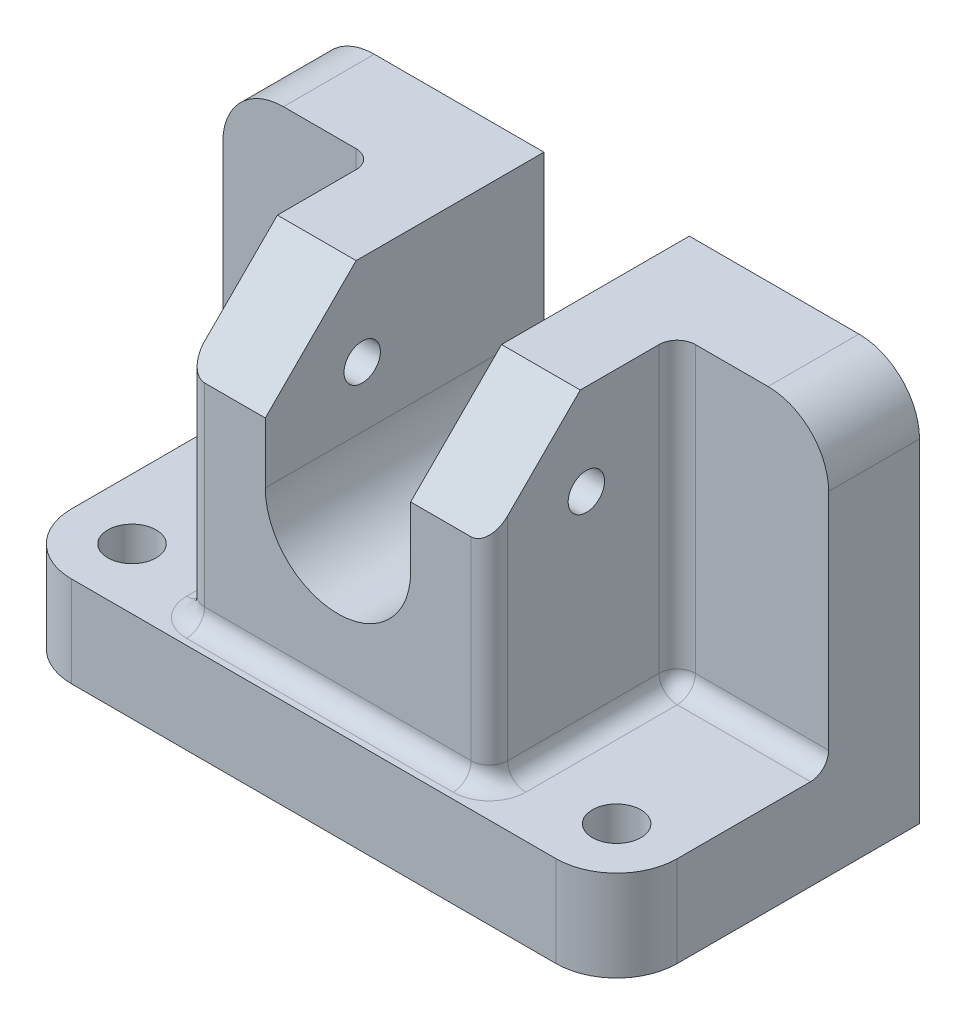
ISO-10303-21;
HEADER;
FILE_DESCRIPTION(('STEP AP214'),'2;1');
FILE_NAME('part.step','',(''),(''),'','','');
FILE_SCHEMA(('AUTOMOTIVE_DESIGN { 1 0 10303 214 1 1 1 1 }'));
ENDSEC;
DATA;
#1=APPLICATION_CONTEXT('core data for automotive mechanical design processes');
#2=APPLICATION_PROTOCOL_DEFINITION('international standard','automotive_design',2000,#1);
#3=PRODUCT_CONTEXT('',#1,'mechanical');
#4=PRODUCT('Part','Part','',(#3));
#5=PRODUCT_RELATED_PRODUCT_CATEGORY('part','',(#4));
#6=PRODUCT_DEFINITION_FORMATION('','',#4);
#7=PRODUCT_DEFINITION_CONTEXT('part definition',#1,'design');
#8=PRODUCT_DEFINITION('design','',#6,#7);
#9=PRODUCT_DEFINITION_SHAPE('','',#8);
#10=(LENGTH_UNIT() NAMED_UNIT(*) SI_UNIT(.MILLI.,.METRE.));
#11=(NAMED_UNIT(*) PLANE_ANGLE_UNIT() SI_UNIT($,.RADIAN.));
#12=(NAMED_UNIT(*) SI_UNIT($,.STERADIAN.) SOLID_ANGLE_UNIT());
#13=UNCERTAINTY_MEASURE_WITH_UNIT(LENGTH_MEASURE(1.E-05),#10,'distance_accuracy_value','');
#14=(GEOMETRIC_REPRESENTATION_CONTEXT(3) GLOBAL_UNCERTAINTY_ASSIGNED_CONTEXT((#13)) GLOBAL_UNIT_ASSIGNED_CONTEXT((#10,
#11,#12)) REPRESENTATION_CONTEXT('',''));
#15=CARTESIAN_POINT('',(0.,0.,0.));
#16=DIRECTION('',(0.,0.,1.));
#17=DIRECTION('',(1.,0.,0.));
#18=AXIS2_PLACEMENT_3D('',#15,#16,#17);
#19=CARTESIAN_POINT('',(-50.,15.,50.));
#20=DIRECTION('',(0.,-1.,0.));
#21=DIRECTION('',(0.,0.,-1.));
#22=AXIS2_PLACEMENT_3D('',#19,#20,#21);
#23=PLANE('',#22);
#24=CARTESIAN_POINT('',(40.,15.,40.));
#25=DIRECTION('',(0.,1.,0.));
#26=DIRECTION('',(0.,0.,1.));
#27=AXIS2_PLACEMENT_3D('',#24,#25,#26);
#28=CIRCLE('',#27,4.);
#29=CARTESIAN_POINT('',(40.,15.,44.));
#30=VERTEX_POINT('',#29);
#31=EDGE_CURVE('E551',#30,#30,#28,.T.);
#32=ORIENTED_EDGE('',*,*,#31,.F.);
#33=EDGE_LOOP('',(#32));
#34=FACE_BOUND('',#33,.T.);
#35=DIRECTION('',(0.,0.,-1.));
#36=VECTOR('',#35,1.);
#37=CARTESIAN_POINT('',(50.,15.,50.));
#38=LINE('',#37,#36);
#39=CARTESIAN_POINT('',(50.,15.,40.));
#40=VERTEX_POINT('',#39);
#41=CARTESIAN_POINT('',(50.,15.,18.));
#42=VERTEX_POINT('',#41);
#43=EDGE_CURVE('E440',#40,#42,#38,.T.);
#44=ORIENTED_EDGE('',*,*,#43,.T.);
#45=DIRECTION('',(1.,0.,0.));
#46=VECTOR('',#45,1.);
#47=CARTESIAN_POINT('',(28.,15.,18.));
#48=LINE('',#47,#46);
#49=CARTESIAN_POINT('',(28.,15.,18.));
#50=VERTEX_POINT('',#49);
#51=EDGE_CURVE('E373',#42,#50,#48,.F.);
#52=ORIENTED_EDGE('',*,*,#51,.T.);
#53=DIRECTION('',(0.,0.,-1.));
#54=VECTOR('',#53,1.);
#55=CARTESIAN_POINT('',(28.,15.,43.));
#56=LINE('',#55,#54);
#57=CARTESIAN_POINT('',(28.,15.,43.));
#58=VERTEX_POINT('',#57);
#59=EDGE_CURVE('E371',#50,#58,#56,.F.);
#60=ORIENTED_EDGE('',*,*,#59,.T.);
#61=CARTESIAN_POINT('',(22.,15.,43.));
#62=DIRECTION('',(0.,-1.,0.));
#63=DIRECTION('',(0.,0.,-1.));
#64=AXIS2_PLACEMENT_3D('',#61,#62,#63);
#65=CIRCLE('',#64,6.);
#66=CARTESIAN_POINT('',(22.,15.,49.));
#67=VERTEX_POINT('',#66);
#68=EDGE_CURVE('E369',#58,#67,#65,.T.);
#69=ORIENTED_EDGE('',*,*,#68,.T.);
#70=DIRECTION('',(1.,0.,0.));
#71=VECTOR('',#70,1.);
#72=CARTESIAN_POINT('',(-22.,15.,49.));
#73=LINE('',#72,#71);
#74=CARTESIAN_POINT('',(-22.,15.,49.));
#75=VERTEX_POINT('',#74);
#76=EDGE_CURVE('E367',#67,#75,#73,.F.);
#77=ORIENTED_EDGE('',*,*,#76,.T.);
#78=CARTESIAN_POINT('',(-22.,15.,43.));
#79=DIRECTION('',(0.,-1.,0.));
#80=DIRECTION('',(0.,0.,-1.));
#81=AXIS2_PLACEMENT_3D('',#78,#79,#80);
#82=CIRCLE('',#81,6.);
#83=CARTESIAN_POINT('',(-28.,15.,43.));
#84=VERTEX_POINT('',#83);
#85=EDGE_CURVE('E365',#75,#84,#82,.T.);
#86=ORIENTED_EDGE('',*,*,#85,.T.);
#87=DIRECTION('',(0.,0.,1.));
#88=VECTOR('',#87,1.);
#89=CARTESIAN_POINT('',(-28.,15.,18.));
#90=LINE('',#89,#88);
#91=CARTESIAN_POINT('',(-28.,15.,18.));
#92=VERTEX_POINT('',#91);
#93=EDGE_CURVE('E363',#84,#92,#90,.F.);
#94=ORIENTED_EDGE('',*,*,#93,.T.);
#95=DIRECTION('',(1.,0.,0.));
#96=VECTOR('',#95,1.);
#97=CARTESIAN_POINT('',(-50.,15.,18.));
#98=LINE('',#97,#96);
#99=CARTESIAN_POINT('',(-50.,15.,18.));
#100=VERTEX_POINT('',#99);
#101=EDGE_CURVE('E361',#92,#100,#98,.F.);
#102=ORIENTED_EDGE('',*,*,#101,.T.);
#103=DIRECTION('',(0.,0.,-1.));
#104=VECTOR('',#103,1.);
#105=CARTESIAN_POINT('',(-50.,15.,50.));
#106=LINE('',#105,#104);
#107=CARTESIAN_POINT('',(-50.,15.,40.));
#108=VERTEX_POINT('',#107);
#109=EDGE_CURVE('E441',#108,#100,#106,.T.);
#110=ORIENTED_EDGE('',*,*,#109,.F.);
#111=CARTESIAN_POINT('',(-40.,15.,40.));
#112=DIRECTION('',(0.,-1.,0.));
#113=DIRECTION('',(0.,0.,-1.));
#114=AXIS2_PLACEMENT_3D('',#111,#112,#113);
#115=CIRCLE('',#114,10.);
#116=CARTESIAN_POINT('',(-40.,15.,50.));
#117=VERTEX_POINT('',#116);
#118=EDGE_CURVE('E309',#108,#117,#115,.F.);
#119=ORIENTED_EDGE('',*,*,#118,.T.);
#120=DIRECTION('',(1.,0.,0.));
#121=VECTOR('',#120,1.);
#122=CARTESIAN_POINT('',(-50.,15.,50.));
#123=LINE('',#122,#121);
#124=CARTESIAN_POINT('',(40.,15.,50.));
#125=VERTEX_POINT('',#124);
#126=EDGE_CURVE('E446',#117,#125,#123,.T.);
#127=ORIENTED_EDGE('',*,*,#126,.T.);
#128=CARTESIAN_POINT('',(40.,15.,40.));
#129=DIRECTION('',(0.,-1.,0.));
#130=DIRECTION('',(0.,0.,-1.));
#131=AXIS2_PLACEMENT_3D('',#128,#129,#130);
#132=CIRCLE('',#131,10.);
#133=EDGE_CURVE('E307',#125,#40,#132,.F.);
#134=ORIENTED_EDGE('',*,*,#133,.T.);
#135=EDGE_LOOP('',(#44,#52,#60,#69,#77,#86,#94,#102,#110,#119,#127,#134));
#136=FACE_BOUND('',#135,.T.);
#137=CARTESIAN_POINT('',(-40.,15.,40.));
#138=DIRECTION('',(0.,1.,0.));
#139=DIRECTION('',(0.,0.,1.));
#140=AXIS2_PLACEMENT_3D('',#137,#138,#139);
#141=CIRCLE('',#140,4.);
#142=CARTESIAN_POINT('',(-40.,15.,44.));
#143=VERTEX_POINT('',#142);
#144=EDGE_CURVE('E545',#143,#143,#141,.T.);
#145=ORIENTED_EDGE('',*,*,#144,.F.);
#146=EDGE_LOOP('',(#145));
#147=FACE_BOUND('',#146,.T.);
#148=ADVANCED_FACE('F46',(#34,#136,#147),#23,.F.);
#149=CARTESIAN_POINT('',(-50.,65.,50.));
#150=DIRECTION('',(0.,-1.,0.));
#151=DIRECTION('',(0.,0.,-1.));
#152=AXIS2_PLACEMENT_3D('',#149,#150,#151);
#153=PLANE('',#152);
#154=DIRECTION('',(0.,0.,1.));
#155=VECTOR('',#154,1.);
#156=CARTESIAN_POINT('',(25.,65.,15.));
#157=LINE('',#156,#155);
#158=CARTESIAN_POINT('',(25.,65.,18.));
#159=VERTEX_POINT('',#158);
#160=CARTESIAN_POINT('',(25.,65.,30.9999999999999));
#161=VERTEX_POINT('',#160);
#162=EDGE_CURVE('E432',#159,#161,#157,.T.);
#163=ORIENTED_EDGE('',*,*,#162,.F.);
#164=CARTESIAN_POINT('',(28.,65.,18.));
#165=DIRECTION('',(0.,-1.,0.));
#166=DIRECTION('',(0.,0.,-1.));
#167=AXIS2_PLACEMENT_3D('',#164,#165,#166);
#168=CIRCLE('',#167,3.);
#169=CARTESIAN_POINT('',(28.,65.,15.));
#170=VERTEX_POINT('',#169);
#171=EDGE_CURVE('E340',#159,#170,#168,.T.);
#172=ORIENTED_EDGE('',*,*,#171,.T.);
#173=DIRECTION('',(1.,0.,0.));
#174=VECTOR('',#173,1.);
#175=CARTESIAN_POINT('',(-50.,65.,15.));
#176=LINE('',#175,#174);
#177=CARTESIAN_POINT('',(40.,65.,15.));
#178=VERTEX_POINT('',#177);
#179=EDGE_CURVE('E454',#170,#178,#176,.T.);
#180=ORIENTED_EDGE('',*,*,#179,.T.);
#181=DIRECTION('',(0.,0.,-1.));
#182=VECTOR('',#181,1.);
#183=CARTESIAN_POINT('',(40.,65.,50.));
#184=LINE('',#183,#182);
#185=CARTESIAN_POINT('',(40.,65.,0.));
#186=VERTEX_POINT('',#185);
#187=EDGE_CURVE('E316',#178,#186,#184,.T.);
#188=ORIENTED_EDGE('',*,*,#187,.T.);
#189=DIRECTION('',(-1.,0.,0.));
#190=VECTOR('',#189,1.);
#191=CARTESIAN_POINT('',(-50.,65.,0.));
#192=LINE('',#191,#190);
#193=CARTESIAN_POINT('',(12.,65.,0.));
#194=VERTEX_POINT('',#193);
#195=EDGE_CURVE('E260',#186,#194,#192,.T.);
#196=ORIENTED_EDGE('',*,*,#195,.T.);
#197=DIRECTION('',(0.,0.,1.));
#198=VECTOR('',#197,1.);
#199=CARTESIAN_POINT('',(12.,65.,0.));
#200=LINE('',#199,#198);
#201=CARTESIAN_POINT('',(12.,65.,30.9999999999999));
#202=VERTEX_POINT('',#201);
#203=EDGE_CURVE('E429',#194,#202,#200,.T.);
#204=ORIENTED_EDGE('',*,*,#203,.T.);
#205=DIRECTION('',(1.,0.,0.));
#206=VECTOR('',#205,1.);
#207=CARTESIAN_POINT('',(-50.,65.,31.));
#208=LINE('',#207,#206);
#209=EDGE_CURVE('E286',#202,#161,#208,.T.);
#210=ORIENTED_EDGE('',*,*,#209,.T.);
#211=EDGE_LOOP('',(#163,#172,#180,#188,#196,#204,#210));
#212=FACE_BOUND('',#211,.T.);
#213=ADVANCED_FACE('F589',(#212),#153,.F.);
#214=CARTESIAN_POINT('',(-50.,65.,15.));
#215=DIRECTION('',(0.,0.,-1.));
#216=DIRECTION('',(0.,1.,0.));
#217=AXIS2_PLACEMENT_3D('',#214,#215,#216);
#218=PLANE('',#217);
#219=DIRECTION('',(0.,-1.,0.));
#220=VECTOR('',#219,1.);
#221=CARTESIAN_POINT('',(28.,15.,15.));
#222=LINE('',#221,#220);
#223=CARTESIAN_POINT('',(28.,18.,15.));
#224=VERTEX_POINT('',#223);
#225=EDGE_CURVE('E330',#170,#224,#222,.T.);
#226=ORIENTED_EDGE('',*,*,#225,.T.);
#227=DIRECTION('',(1.,0.,0.));
#228=VECTOR('',#227,1.);
#229=CARTESIAN_POINT('',(50.,18.,15.));
#230=LINE('',#229,#228);
#231=CARTESIAN_POINT('',(50.,18.,15.));
#232=VERTEX_POINT('',#231);
#233=EDGE_CURVE('E358',#224,#232,#230,.T.);
#234=ORIENTED_EDGE('',*,*,#233,.T.);
#235=DIRECTION('',(0.,1.,0.));
#236=VECTOR('',#235,1.);
#237=CARTESIAN_POINT('',(50.,65.,15.));
#238=LINE('',#237,#236);
#239=CARTESIAN_POINT('',(50.,55.,15.));
#240=VERTEX_POINT('',#239);
#241=EDGE_CURVE('E444',#232,#240,#238,.T.);
#242=ORIENTED_EDGE('',*,*,#241,.T.);
#243=CARTESIAN_POINT('',(40.,55.,15.));
#244=DIRECTION('',(0.,0.,-1.));
#245=DIRECTION('',(0.,1.,0.));
#246=AXIS2_PLACEMENT_3D('',#243,#244,#245);
#247=CIRCLE('',#246,10.);
#248=EDGE_CURVE('E322',#240,#178,#247,.F.);
#249=ORIENTED_EDGE('',*,*,#248,.T.);
#250=ORIENTED_EDGE('',*,*,#179,.F.);
#251=EDGE_LOOP('',(#226,#234,#242,#249,#250));
#252=FACE_BOUND('',#251,.T.);
#253=ADVANCED_FACE('F479',(#252),#218,.F.);
#254=DIRECTION('',(0.,1.,0.));
#255=VECTOR('',#254,1.);
#256=CARTESIAN_POINT('',(-50.,65.,15.));
#257=LINE('',#256,#255);
#258=CARTESIAN_POINT('',(-50.,18.,15.));
#259=VERTEX_POINT('',#258);
#260=CARTESIAN_POINT('',(-50.,55.,15.));
#261=VERTEX_POINT('',#260);
#262=EDGE_CURVE('E443',#259,#261,#257,.T.);
#263=ORIENTED_EDGE('',*,*,#262,.F.);
#264=DIRECTION('',(1.,0.,0.));
#265=VECTOR('',#264,1.);
#266=CARTESIAN_POINT('',(-28.,18.,15.));
#267=LINE('',#266,#265);
#268=CARTESIAN_POINT('',(-28.,18.,15.));
#269=VERTEX_POINT('',#268);
#270=EDGE_CURVE('E68',#259,#269,#267,.T.);
#271=ORIENTED_EDGE('',*,*,#270,.T.);
#272=DIRECTION('',(0.,-1.,0.));
#273=VECTOR('',#272,1.);
#274=CARTESIAN_POINT('',(-28.,65.,15.));
#275=LINE('',#274,#273);
#276=CARTESIAN_POINT('',(-28.,65.,15.));
#277=VERTEX_POINT('',#276);
#278=EDGE_CURVE('E338',#269,#277,#275,.F.);
#279=ORIENTED_EDGE('',*,*,#278,.T.);
#280=CARTESIAN_POINT('',(-40.,65.,15.));
#281=VERTEX_POINT('',#280);
#282=EDGE_CURVE('E450',#281,#277,#176,.T.);
#283=ORIENTED_EDGE('',*,*,#282,.F.);
#284=CARTESIAN_POINT('',(-40.,55.,15.));
#285=DIRECTION('',(0.,0.,-1.));
#286=DIRECTION('',(0.,1.,0.));
#287=AXIS2_PLACEMENT_3D('',#284,#285,#286);
#288=CIRCLE('',#287,10.);
#289=EDGE_CURVE('E327',#281,#261,#288,.F.);
#290=ORIENTED_EDGE('',*,*,#289,.T.);
#291=EDGE_LOOP('',(#263,#271,#279,#283,#290));
#292=FACE_BOUND('',#291,.T.);
#293=ADVANCED_FACE('F614',(#292),#218,.F.);
#294=CARTESIAN_POINT('',(-50.,0.,50.));
#295=DIRECTION('',(1.,0.,0.));
#296=DIRECTION('',(0.,0.,-1.));
#297=AXIS2_PLACEMENT_3D('',#294,#295,#296);
#298=PLANE('',#297);
#299=DIRECTION('',(0.,0.,-1.));
#300=VECTOR('',#299,1.);
#301=CARTESIAN_POINT('',(-50.,0.,50.));
#302=LINE('',#301,#300);
#303=CARTESIAN_POINT('',(-50.,0.,40.));
#304=VERTEX_POINT('',#303);
#305=CARTESIAN_POINT('',(-50.,0.,0.));
#306=VERTEX_POINT('',#305);
#307=EDGE_CURVE('E271',#304,#306,#302,.T.);
#308=ORIENTED_EDGE('',*,*,#307,.F.);
#309=DIRECTION('',(0.,-1.,0.));
#310=VECTOR('',#309,1.);
#311=CARTESIAN_POINT('',(-50.,0.,40.));
#312=LINE('',#311,#310);
#313=EDGE_CURVE('E305',#304,#108,#312,.F.);
#314=ORIENTED_EDGE('',*,*,#313,.T.);
#315=ORIENTED_EDGE('',*,*,#109,.T.);
#316=CARTESIAN_POINT('',(-50.,18.,18.));
#317=DIRECTION('',(1.,0.,0.));
#318=DIRECTION('',(0.,0.,-1.));
#319=AXIS2_PLACEMENT_3D('',#316,#317,#318);
#320=CIRCLE('',#319,3.);
#321=EDGE_CURVE('E13',#100,#259,#320,.T.);
#322=ORIENTED_EDGE('',*,*,#321,.T.);
#323=ORIENTED_EDGE('',*,*,#262,.T.);
#324=DIRECTION('',(0.,0.,-1.));
#325=VECTOR('',#324,1.);
#326=CARTESIAN_POINT('',(-50.,55.,50.));
#327=LINE('',#326,#325);
#328=CARTESIAN_POINT('',(-50.,55.,0.));
#329=VERTEX_POINT('',#328);
#330=EDGE_CURVE('E302',#261,#329,#327,.T.);
#331=ORIENTED_EDGE('',*,*,#330,.T.);
#332=DIRECTION('',(0.,-1.,0.));
#333=VECTOR('',#332,1.);
#334=CARTESIAN_POINT('',(-50.,0.,0.));
#335=LINE('',#334,#333);
#336=EDGE_CURVE('E453',#329,#306,#335,.T.);
#337=ORIENTED_EDGE('',*,*,#336,.T.);
#338=EDGE_LOOP('',(#308,#314,#315,#322,#323,#331,#337));
#339=FACE_BOUND('',#338,.T.);
#340=ADVANCED_FACE('F610',(#339),#298,.F.);
#341=CARTESIAN_POINT('',(-50.,0.,50.));
#342=DIRECTION('',(0.,1.,0.));
#343=DIRECTION('',(0.,0.,1.));
#344=AXIS2_PLACEMENT_3D('',#341,#342,#343);
#345=PLANE('',#344);
#346=CARTESIAN_POINT('',(40.,0.,40.));
#347=DIRECTION('',(0.,1.,0.));
#348=DIRECTION('',(0.,0.,1.));
#349=AXIS2_PLACEMENT_3D('',#346,#347,#348);
#350=CIRCLE('',#349,4.);
#351=CARTESIAN_POINT('',(40.,0.,44.));
#352=VERTEX_POINT('',#351);
#353=EDGE_CURVE('E548',#352,#352,#350,.T.);
#354=ORIENTED_EDGE('',*,*,#353,.T.);
#355=EDGE_LOOP('',(#354));
#356=FACE_BOUND('',#355,.T.);
#357=CARTESIAN_POINT('',(-40.,0.,40.));
#358=DIRECTION('',(0.,1.,0.));
#359=DIRECTION('',(0.,0.,1.));
#360=AXIS2_PLACEMENT_3D('',#357,#358,#359);
#361=CIRCLE('',#360,4.);
#362=CARTESIAN_POINT('',(-40.,0.,44.));
#363=VERTEX_POINT('',#362);
#364=EDGE_CURVE('E395',#363,#363,#361,.T.);
#365=ORIENTED_EDGE('',*,*,#364,.T.);
#366=EDGE_LOOP('',(#365));
#367=FACE_BOUND('',#366,.T.);
#368=DIRECTION('',(1.,0.,0.));
#369=VECTOR('',#368,1.);
#370=CARTESIAN_POINT('',(-50.,0.,50.));
#371=LINE('',#370,#369);
#372=CARTESIAN_POINT('',(-40.,0.,50.));
#373=VERTEX_POINT('',#372);
#374=CARTESIAN_POINT('',(40.,0.,50.));
#375=VERTEX_POINT('',#374);
#376=EDGE_CURVE('E263',#373,#375,#371,.T.);
#377=ORIENTED_EDGE('',*,*,#376,.F.);
#378=CARTESIAN_POINT('',(-40.,0.,40.));
#379=DIRECTION('',(0.,1.,0.));
#380=DIRECTION('',(0.,0.,1.));
#381=AXIS2_PLACEMENT_3D('',#378,#379,#380);
#382=CIRCLE('',#381,10.);
#383=EDGE_CURVE('E300',#373,#304,#382,.F.);
#384=ORIENTED_EDGE('',*,*,#383,.T.);
#385=ORIENTED_EDGE('',*,*,#307,.T.);
#386=DIRECTION('',(1.,0.,0.));
#387=VECTOR('',#386,1.);
#388=CARTESIAN_POINT('',(-50.,0.,0.));
#389=LINE('',#388,#387);
#390=CARTESIAN_POINT('',(50.,0.,0.));
#391=VERTEX_POINT('',#390);
#392=EDGE_CURVE('E265',#306,#391,#389,.T.);
#393=ORIENTED_EDGE('',*,*,#392,.T.);
#394=DIRECTION('',(0.,0.,-1.));
#395=VECTOR('',#394,1.);
#396=CARTESIAN_POINT('',(50.,0.,50.));
#397=LINE('',#396,#395);
#398=CARTESIAN_POINT('',(50.,0.,40.));
#399=VERTEX_POINT('',#398);
#400=EDGE_CURVE('E269',#399,#391,#397,.T.);
#401=ORIENTED_EDGE('',*,*,#400,.F.);
#402=CARTESIAN_POINT('',(40.,0.,40.));
#403=DIRECTION('',(0.,1.,0.));
#404=DIRECTION('',(0.,0.,1.));
#405=AXIS2_PLACEMENT_3D('',#402,#403,#404);
#406=CIRCLE('',#405,10.);
#407=EDGE_CURVE('E298',#399,#375,#406,.F.);
#408=ORIENTED_EDGE('',*,*,#407,.T.);
#409=EDGE_LOOP('',(#377,#384,#385,#393,#401,#408));
#410=FACE_BOUND('',#409,.T.);
#411=ADVANCED_FACE('F465',(#356,#367,#410),#345,.F.);
#412=CARTESIAN_POINT('',(50.,0.,50.));
#413=DIRECTION('',(-1.,0.,0.));
#414=DIRECTION('',(0.,0.,1.));
#415=AXIS2_PLACEMENT_3D('',#412,#413,#414);
#416=PLANE('',#415);
#417=ORIENTED_EDGE('',*,*,#43,.F.);
#418=DIRECTION('',(0.,1.,0.));
#419=VECTOR('',#418,1.);
#420=CARTESIAN_POINT('',(50.,0.,40.));
#421=LINE('',#420,#419);
#422=EDGE_CURVE('E314',#40,#399,#421,.F.);
#423=ORIENTED_EDGE('',*,*,#422,.T.);
#424=ORIENTED_EDGE('',*,*,#400,.T.);
#425=DIRECTION('',(0.,1.,0.));
#426=VECTOR('',#425,1.);
#427=CARTESIAN_POINT('',(50.,0.,0.));
#428=LINE('',#427,#426);
#429=CARTESIAN_POINT('',(50.,55.,0.));
#430=VERTEX_POINT('',#429);
#431=EDGE_CURVE('E261',#391,#430,#428,.T.);
#432=ORIENTED_EDGE('',*,*,#431,.T.);
#433=DIRECTION('',(0.,0.,-1.));
#434=VECTOR('',#433,1.);
#435=CARTESIAN_POINT('',(50.,55.,50.));
#436=LINE('',#435,#434);
#437=EDGE_CURVE('E311',#430,#240,#436,.F.);
#438=ORIENTED_EDGE('',*,*,#437,.T.);
#439=ORIENTED_EDGE('',*,*,#241,.F.);
#440=CARTESIAN_POINT('',(50.,18.,18.));
#441=DIRECTION('',(-1.,0.,0.));
#442=DIRECTION('',(0.,0.,1.));
#443=AXIS2_PLACEMENT_3D('',#440,#441,#442);
#444=CIRCLE('',#443,3.);
#445=EDGE_CURVE('E55',#232,#42,#444,.T.);
#446=ORIENTED_EDGE('',*,*,#445,.T.);
#447=EDGE_LOOP('',(#417,#423,#424,#432,#438,#439,#446));
#448=FACE_BOUND('',#447,.T.);
#449=ADVANCED_FACE('F471',(#448),#416,.F.);
#450=CARTESIAN_POINT('',(-12.,65.,0.));
#451=VERTEX_POINT('',#450);
#452=CARTESIAN_POINT('',(-40.,65.,0.));
#453=VERTEX_POINT('',#452);
#454=EDGE_CURVE('E249',#451,#453,#192,.T.);
#455=ORIENTED_EDGE('',*,*,#454,.T.);
#456=DIRECTION('',(0.,0.,-1.));
#457=VECTOR('',#456,1.);
#458=CARTESIAN_POINT('',(-40.,65.,50.));
#459=LINE('',#458,#457);
#460=EDGE_CURVE('E325',#453,#281,#459,.F.);
#461=ORIENTED_EDGE('',*,*,#460,.T.);
#462=ORIENTED_EDGE('',*,*,#282,.T.);
#463=CARTESIAN_POINT('',(-28.,65.,18.));
#464=DIRECTION('',(0.,-1.,0.));
#465=DIRECTION('',(0.,0.,-1.));
#466=AXIS2_PLACEMENT_3D('',#463,#464,#465);
#467=CIRCLE('',#466,3.);
#468=CARTESIAN_POINT('',(-25.,65.,18.));
#469=VERTEX_POINT('',#468);
#470=EDGE_CURVE('E342',#277,#469,#467,.T.);
#471=ORIENTED_EDGE('',*,*,#470,.T.);
#472=DIRECTION('',(0.,0.,-1.));
#473=VECTOR('',#472,1.);
#474=CARTESIAN_POINT('',(-25.,65.,15.));
#475=LINE('',#474,#473);
#476=CARTESIAN_POINT('',(-25.,65.,31.));
#477=VERTEX_POINT('',#476);
#478=EDGE_CURVE('E437',#477,#469,#475,.T.);
#479=ORIENTED_EDGE('',*,*,#478,.F.);
#480=DIRECTION('',(1.,0.,0.));
#481=VECTOR('',#480,1.);
#482=CARTESIAN_POINT('',(-50.,65.,31.));
#483=LINE('',#482,#481);
#484=CARTESIAN_POINT('',(-12.,65.,30.9999999999999));
#485=VERTEX_POINT('',#484);
#486=EDGE_CURVE('E253',#477,#485,#483,.T.);
#487=ORIENTED_EDGE('',*,*,#486,.T.);
#488=DIRECTION('',(0.,0.,1.));
#489=VECTOR('',#488,1.);
#490=CARTESIAN_POINT('',(-12.,65.,0.));
#491=LINE('',#490,#489);
#492=EDGE_CURVE('E235',#451,#485,#491,.T.);
#493=ORIENTED_EDGE('',*,*,#492,.F.);
#494=EDGE_LOOP('',(#455,#461,#462,#471,#479,#487,#493));
#495=FACE_BOUND('',#494,.T.);
#496=ADVANCED_FACE('F248',(#495),#153,.F.);
#497=CARTESIAN_POINT('',(-50.,65.,50.));
#498=DIRECTION('',(0.,0.,-1.));
#499=DIRECTION('',(-1.,0.,0.));
#500=AXIS2_PLACEMENT_3D('',#497,#498,#499);
#501=PLANE('',#500);
#502=ORIENTED_EDGE('',*,*,#126,.F.);
#503=DIRECTION('',(0.,-1.,0.));
#504=VECTOR('',#503,1.);
#505=CARTESIAN_POINT('',(-40.,65.,50.));
#506=LINE('',#505,#504);
#507=EDGE_CURVE('E295',#117,#373,#506,.T.);
#508=ORIENTED_EDGE('',*,*,#507,.T.);
#509=ORIENTED_EDGE('',*,*,#376,.T.);
#510=DIRECTION('',(0.,1.,0.));
#511=VECTOR('',#510,1.);
#512=CARTESIAN_POINT('',(40.,65.,50.));
#513=LINE('',#512,#511);
#514=EDGE_CURVE('E292',#375,#125,#513,.T.);
#515=ORIENTED_EDGE('',*,*,#514,.T.);
#516=EDGE_LOOP('',(#502,#508,#509,#515));
#517=FACE_BOUND('',#516,.T.);
#518=ADVANCED_FACE('F599',(#517),#501,.F.);
#519=CARTESIAN_POINT('',(-50.,65.,0.));
#520=DIRECTION('',(0.,0.,-1.));
#521=DIRECTION('',(-1.,0.,0.));
#522=AXIS2_PLACEMENT_3D('',#519,#520,#521);
#523=PLANE('',#522);
#524=ORIENTED_EDGE('',*,*,#195,.F.);
#525=CARTESIAN_POINT('',(40.,55.,0.));
#526=DIRECTION('',(0.,0.,-1.));
#527=DIRECTION('',(-1.,0.,0.));
#528=AXIS2_PLACEMENT_3D('',#525,#526,#527);
#529=CIRCLE('',#528,10.);
#530=EDGE_CURVE('E320',#186,#430,#529,.T.);
#531=ORIENTED_EDGE('',*,*,#530,.T.);
#532=ORIENTED_EDGE('',*,*,#431,.F.);
#533=ORIENTED_EDGE('',*,*,#392,.F.);
#534=ORIENTED_EDGE('',*,*,#336,.F.);
#535=CARTESIAN_POINT('',(-40.,55.,0.));
#536=DIRECTION('',(0.,0.,-1.));
#537=DIRECTION('',(-1.,0.,0.));
#538=AXIS2_PLACEMENT_3D('',#535,#536,#537);
#539=CIRCLE('',#538,10.);
#540=EDGE_CURVE('E259',#329,#453,#539,.T.);
#541=ORIENTED_EDGE('',*,*,#540,.T.);
#542=ORIENTED_EDGE('',*,*,#454,.F.);
#543=DIRECTION('',(0.,-1.,0.));
#544=VECTOR('',#543,1.);
#545=CARTESIAN_POINT('',(-12.,65.,0.));
#546=LINE('',#545,#544);
#547=CARTESIAN_POINT('',(-12.,40.,0.));
#548=VERTEX_POINT('',#547);
#549=EDGE_CURVE('E232',#451,#548,#546,.T.);
#550=ORIENTED_EDGE('',*,*,#549,.T.);
#551=CARTESIAN_POINT('',(0.,40.,0.));
#552=DIRECTION('',(0.,0.,1.));
#553=DIRECTION('',(1.,0.,0.));
#554=AXIS2_PLACEMENT_3D('',#551,#552,#553);
#555=CIRCLE('',#554,12.);
#556=CARTESIAN_POINT('',(12.,40.,0.));
#557=VERTEX_POINT('',#556);
#558=EDGE_CURVE('E243',#548,#557,#555,.T.);
#559=ORIENTED_EDGE('',*,*,#558,.T.);
#560=DIRECTION('',(0.,1.,0.));
#561=VECTOR('',#560,1.);
#562=CARTESIAN_POINT('',(12.,40.,0.));
#563=LINE('',#562,#561);
#564=EDGE_CURVE('E254',#557,#194,#563,.T.);
#565=ORIENTED_EDGE('',*,*,#564,.T.);
#566=EDGE_LOOP('',(#524,#531,#532,#533,#534,#541,#542,#550,#559,#565));
#567=FACE_BOUND('',#566,.T.);
#568=ADVANCED_FACE('F257',(#567),#523,.T.);
#569=CARTESIAN_POINT('',(25.,123.830264320331,15.));
#570=DIRECTION('',(-1.,0.,0.));
#571=DIRECTION('',(0.,0.,1.));
#572=AXIS2_PLACEMENT_3D('',#569,#570,#571);
#573=PLANE('',#572);
#574=CARTESIAN_POINT('',(25.,50.,30.));
#575=DIRECTION('',(1.,0.,0.));
#576=DIRECTION('',(0.,0.,-1.));
#577=AXIS2_PLACEMENT_3D('',#574,#575,#576);
#578=CIRCLE('',#577,3.);
#579=CARTESIAN_POINT('',(25.,50.,27.));
#580=VERTEX_POINT('',#579);
#581=EDGE_CURVE('E560',#580,#580,#578,.T.);
#582=ORIENTED_EDGE('',*,*,#581,.F.);
#583=EDGE_LOOP('',(#582));
#584=FACE_BOUND('',#583,.T.);
#585=DIRECTION('',(0.,-1.,0.));
#586=VECTOR('',#585,1.);
#587=CARTESIAN_POINT('',(25.,123.830264320331,43.));
#588=LINE('',#587,#586);
#589=CARTESIAN_POINT('',(25.,53.,43.));
#590=VERTEX_POINT('',#589);
#591=CARTESIAN_POINT('',(25.,18.,43.));
#592=VERTEX_POINT('',#591);
#593=EDGE_CURVE('E353',#590,#592,#588,.T.);
#594=ORIENTED_EDGE('',*,*,#593,.T.);
#595=DIRECTION('',(0.,0.,-1.));
#596=VECTOR('',#595,1.);
#597=CARTESIAN_POINT('',(25.,18.,18.));
#598=LINE('',#597,#596);
#599=CARTESIAN_POINT('',(25.,18.,18.));
#600=VERTEX_POINT('',#599);
#601=EDGE_CURVE('E377',#592,#600,#598,.T.);
#602=ORIENTED_EDGE('',*,*,#601,.T.);
#603=DIRECTION('',(0.,-1.,0.));
#604=VECTOR('',#603,1.);
#605=CARTESIAN_POINT('',(25.,65.,18.));
#606=LINE('',#605,#604);
#607=EDGE_CURVE('E333',#600,#159,#606,.F.);
#608=ORIENTED_EDGE('',*,*,#607,.T.);
#609=ORIENTED_EDGE('',*,*,#162,.T.);
#610=DIRECTION('',(0.,0.707106781186546,-0.707106781186549));
#611=VECTOR('',#610,1.);
#612=CARTESIAN_POINT('',(25.,50.,46.));
#613=LINE('',#612,#611);
#614=EDGE_CURVE('E289',#161,#590,#613,.F.);
#615=ORIENTED_EDGE('',*,*,#614,.T.);
#616=EDGE_LOOP('',(#594,#602,#608,#609,#615));
#617=FACE_BOUND('',#616,.T.);
#618=ADVANCED_FACE('F585',(#584,#617),#573,.F.);
#619=CARTESIAN_POINT('',(-25.,123.830264320331,46.));
#620=DIRECTION('',(0.,0.,-1.));
#621=DIRECTION('',(-1.,0.,0.));
#622=AXIS2_PLACEMENT_3D('',#619,#620,#621);
#623=PLANE('',#622);
#624=DIRECTION('',(0.,-1.,0.));
#625=VECTOR('',#624,1.);
#626=CARTESIAN_POINT('',(-22.,123.830264320331,46.));
#627=LINE('',#626,#625);
#628=CARTESIAN_POINT('',(-22.,50.,46.));
#629=VERTEX_POINT('',#628);
#630=CARTESIAN_POINT('',(-22.,18.,46.));
#631=VERTEX_POINT('',#630);
#632=EDGE_CURVE('E346',#629,#631,#627,.T.);
#633=ORIENTED_EDGE('',*,*,#632,.T.);
#634=DIRECTION('',(1.,0.,0.));
#635=VECTOR('',#634,1.);
#636=CARTESIAN_POINT('',(22.,18.,46.));
#637=LINE('',#636,#635);
#638=CARTESIAN_POINT('',(22.,18.,46.));
#639=VERTEX_POINT('',#638);
#640=EDGE_CURVE('E381',#631,#639,#637,.T.);
#641=ORIENTED_EDGE('',*,*,#640,.T.);
#642=DIRECTION('',(0.,-1.,0.));
#643=VECTOR('',#642,1.);
#644=CARTESIAN_POINT('',(22.,123.830264320331,46.));
#645=LINE('',#644,#643);
#646=CARTESIAN_POINT('',(22.,50.,46.));
#647=VERTEX_POINT('',#646);
#648=EDGE_CURVE('E344',#639,#647,#645,.F.);
#649=ORIENTED_EDGE('',*,*,#648,.T.);
#650=DIRECTION('',(-1.,0.,0.));
#651=VECTOR('',#650,1.);
#652=CARTESIAN_POINT('',(-25.,50.,46.));
#653=LINE('',#652,#651);
#654=CARTESIAN_POINT('',(12.,50.,46.));
#655=VERTEX_POINT('',#654);
#656=EDGE_CURVE('E274',#647,#655,#653,.T.);
#657=ORIENTED_EDGE('',*,*,#656,.T.);
#658=DIRECTION('',(0.,1.,0.));
#659=VECTOR('',#658,1.);
#660=CARTESIAN_POINT('',(12.,40.,46.));
#661=LINE('',#660,#659);
#662=CARTESIAN_POINT('',(12.,40.,46.));
#663=VERTEX_POINT('',#662);
#664=EDGE_CURVE('E244',#663,#655,#661,.T.);
#665=ORIENTED_EDGE('',*,*,#664,.F.);
#666=CARTESIAN_POINT('',(0.,40.,46.));
#667=DIRECTION('',(0.,0.,1.));
#668=DIRECTION('',(1.,0.,0.));
#669=AXIS2_PLACEMENT_3D('',#666,#667,#668);
#670=CIRCLE('',#669,12.);
#671=CARTESIAN_POINT('',(-12.,40.,46.));
#672=VERTEX_POINT('',#671);
#673=EDGE_CURVE('E419',#672,#663,#670,.T.);
#674=ORIENTED_EDGE('',*,*,#673,.F.);
#675=DIRECTION('',(0.,-1.,0.));
#676=VECTOR('',#675,1.);
#677=CARTESIAN_POINT('',(-12.,65.,46.));
#678=LINE('',#677,#676);
#679=CARTESIAN_POINT('',(-12.,50.,46.));
#680=VERTEX_POINT('',#679);
#681=EDGE_CURVE('E414',#680,#672,#678,.T.);
#682=ORIENTED_EDGE('',*,*,#681,.F.);
#683=DIRECTION('',(-1.,0.,0.));
#684=VECTOR('',#683,1.);
#685=CARTESIAN_POINT('',(-25.,50.,46.));
#686=LINE('',#685,#684);
#687=EDGE_CURVE('E276',#680,#629,#686,.T.);
#688=ORIENTED_EDGE('',*,*,#687,.T.);
#689=EDGE_LOOP('',(#633,#641,#649,#657,#665,#674,#682,#688));
#690=FACE_BOUND('',#689,.T.);
#691=ADVANCED_FACE('F535',(#690),#623,.F.);
#692=CARTESIAN_POINT('',(-25.,123.830264320331,15.));
#693=DIRECTION('',(1.,0.,0.));
#694=DIRECTION('',(0.,0.,-1.));
#695=AXIS2_PLACEMENT_3D('',#692,#693,#694);
#696=PLANE('',#695);
#697=CARTESIAN_POINT('',(-25.,50.,30.));
#698=DIRECTION('',(1.,0.,0.));
#699=DIRECTION('',(0.,0.,-1.));
#700=AXIS2_PLACEMENT_3D('',#697,#698,#699);
#701=CIRCLE('',#700,2.99999999999999);
#702=CARTESIAN_POINT('',(-25.,50.,27.));
#703=VERTEX_POINT('',#702);
#704=EDGE_CURVE('E554',#703,#703,#701,.T.);
#705=ORIENTED_EDGE('',*,*,#704,.T.);
#706=EDGE_LOOP('',(#705));
#707=FACE_BOUND('',#706,.T.);
#708=DIRECTION('',(0.,-1.,0.));
#709=VECTOR('',#708,1.);
#710=CARTESIAN_POINT('',(-25.,15.,18.));
#711=LINE('',#710,#709);
#712=CARTESIAN_POINT('',(-25.,18.,18.));
#713=VERTEX_POINT('',#712);
#714=EDGE_CURVE('E335',#469,#713,#711,.T.);
#715=ORIENTED_EDGE('',*,*,#714,.T.);
#716=DIRECTION('',(0.,0.,1.));
#717=VECTOR('',#716,1.);
#718=CARTESIAN_POINT('',(-25.,18.,43.));
#719=LINE('',#718,#717);
#720=CARTESIAN_POINT('',(-25.,18.,43.));
#721=VERTEX_POINT('',#720);
#722=EDGE_CURVE('E385',#713,#721,#719,.T.);
#723=ORIENTED_EDGE('',*,*,#722,.T.);
#724=DIRECTION('',(0.,-1.,0.));
#725=VECTOR('',#724,1.);
#726=CARTESIAN_POINT('',(-25.,123.830264320331,43.));
#727=LINE('',#726,#725);
#728=CARTESIAN_POINT('',(-25.,53.,43.));
#729=VERTEX_POINT('',#728);
#730=EDGE_CURVE('E349',#721,#729,#727,.F.);
#731=ORIENTED_EDGE('',*,*,#730,.T.);
#732=DIRECTION('',(0.,-0.707106781186546,0.707106781186549));
#733=VECTOR('',#732,1.);
#734=CARTESIAN_POINT('',(-25.,50.,46.));
#735=LINE('',#734,#733);
#736=EDGE_CURVE('E279',#729,#477,#735,.F.);
#737=ORIENTED_EDGE('',*,*,#736,.T.);
#738=ORIENTED_EDGE('',*,*,#478,.T.);
#739=EDGE_LOOP('',(#715,#723,#731,#737,#738));
#740=FACE_BOUND('',#739,.T.);
#741=ADVANCED_FACE('F526',(#707,#740),#696,.F.);
#742=CARTESIAN_POINT('',(12.,40.,0.));
#743=DIRECTION('',(1.,0.,0.));
#744=DIRECTION('',(0.,0.,-1.));
#745=AXIS2_PLACEMENT_3D('',#742,#743,#744);
#746=PLANE('',#745);
#747=CARTESIAN_POINT('',(12.,50.,30.));
#748=DIRECTION('',(1.,0.,0.));
#749=DIRECTION('',(0.,0.,-1.));
#750=AXIS2_PLACEMENT_3D('',#747,#748,#749);
#751=CIRCLE('',#750,2.99999999999999);
#752=CARTESIAN_POINT('',(12.,50.,27.));
#753=VERTEX_POINT('',#752);
#754=EDGE_CURVE('E557',#753,#753,#751,.T.);
#755=ORIENTED_EDGE('',*,*,#754,.T.);
#756=EDGE_LOOP('',(#755));
#757=FACE_BOUND('',#756,.T.);
#758=ORIENTED_EDGE('',*,*,#664,.T.);
#759=DIRECTION('',(0.,-0.707106781186546,0.707106781186549));
#760=VECTOR('',#759,1.);
#761=CARTESIAN_POINT('',(12.,50.,46.));
#762=LINE('',#761,#760);
#763=EDGE_CURVE('E284',#655,#202,#762,.F.);
#764=ORIENTED_EDGE('',*,*,#763,.T.);
#765=ORIENTED_EDGE('',*,*,#203,.F.);
#766=ORIENTED_EDGE('',*,*,#564,.F.);
#767=DIRECTION('',(0.,0.,1.));
#768=VECTOR('',#767,1.);
#769=CARTESIAN_POINT('',(12.,40.,0.));
#770=LINE('',#769,#768);
#771=EDGE_CURVE('E433',#557,#663,#770,.T.);
#772=ORIENTED_EDGE('',*,*,#771,.T.);
#773=EDGE_LOOP('',(#758,#764,#765,#766,#772));
#774=FACE_BOUND('',#773,.T.);
#775=ADVANCED_FACE('F577',(#757,#774),#746,.F.);
#776=CARTESIAN_POINT('',(0.,40.,0.));
#777=DIRECTION('',(0.,0.,1.));
#778=DIRECTION('',(1.,0.,0.));
#779=AXIS2_PLACEMENT_3D('',#776,#777,#778);
#780=CYLINDRICAL_SURFACE('',#779,12.);
#781=ORIENTED_EDGE('',*,*,#673,.T.);
#782=ORIENTED_EDGE('',*,*,#771,.F.);
#783=ORIENTED_EDGE('',*,*,#558,.F.);
#784=DIRECTION('',(0.,0.,1.));
#785=VECTOR('',#784,1.);
#786=CARTESIAN_POINT('',(-12.,40.,0.));
#787=LINE('',#786,#785);
#788=EDGE_CURVE('E238',#548,#672,#787,.T.);
#789=ORIENTED_EDGE('',*,*,#788,.T.);
#790=EDGE_LOOP('',(#781,#782,#783,#789));
#791=FACE_BOUND('',#790,.T.);
#792=ADVANCED_FACE('F539',(#791),#780,.F.);
#793=CARTESIAN_POINT('',(-12.,65.,0.));
#794=DIRECTION('',(-1.,0.,0.));
#795=DIRECTION('',(0.,-1.,0.));
#796=AXIS2_PLACEMENT_3D('',#793,#794,#795);
#797=PLANE('',#796);
#798=CARTESIAN_POINT('',(-12.,50.,30.));
#799=DIRECTION('',(-1.,0.,0.));
#800=DIRECTION('',(0.,-1.,0.));
#801=AXIS2_PLACEMENT_3D('',#798,#799,#800);
#802=CIRCLE('',#801,2.99999999999999);
#803=CARTESIAN_POINT('',(-12.,47.,30.));
#804=VERTEX_POINT('',#803);
#805=EDGE_CURVE('E50',#804,#804,#802,.T.);
#806=ORIENTED_EDGE('',*,*,#805,.T.);
#807=EDGE_LOOP('',(#806));
#808=FACE_BOUND('',#807,.T.);
#809=ORIENTED_EDGE('',*,*,#492,.T.);
#810=DIRECTION('',(0.,0.707106781186546,-0.707106781186549));
#811=VECTOR('',#810,1.);
#812=CARTESIAN_POINT('',(-12.,50.,46.));
#813=LINE('',#812,#811);
#814=EDGE_CURVE('E282',#485,#680,#813,.F.);
#815=ORIENTED_EDGE('',*,*,#814,.T.);
#816=ORIENTED_EDGE('',*,*,#681,.T.);
#817=ORIENTED_EDGE('',*,*,#788,.F.);
#818=ORIENTED_EDGE('',*,*,#549,.F.);
#819=EDGE_LOOP('',(#809,#815,#816,#817,#818));
#820=FACE_BOUND('',#819,.T.);
#821=ADVANCED_FACE('F234',(#808,#820),#797,.F.);
#822=CARTESIAN_POINT('',(-25.,50.,46.));
#823=DIRECTION('',(0.,-0.707106781186549,-0.707106781186546));
#824=DIRECTION('',(0.,0.707106781186546,-0.707106781186549));
#825=AXIS2_PLACEMENT_3D('',#822,#823,#824);
#826=PLANE('',#825);
#827=ORIENTED_EDGE('',*,*,#736,.F.);
#828=CARTESIAN_POINT('',(-22.,53.,43.));
#829=DIRECTION('',(0.,-0.707106781186549,-0.707106781186546));
#830=DIRECTION('',(0.,-0.707106781186546,0.707106781186549));
#831=AXIS2_PLACEMENT_3D('',#828,#829,#830);
#832=ELLIPSE('',#831,4.24264068711928,3.);
#833=EDGE_CURVE('E351',#729,#629,#832,.F.);
#834=ORIENTED_EDGE('',*,*,#833,.T.);
#835=ORIENTED_EDGE('',*,*,#687,.F.);
#836=ORIENTED_EDGE('',*,*,#814,.F.);
#837=ORIENTED_EDGE('',*,*,#486,.F.);
#838=EDGE_LOOP('',(#827,#834,#835,#836,#837));
#839=FACE_BOUND('',#838,.T.);
#840=ADVANCED_FACE('F530',(#839),#826,.F.);
#841=CARTESIAN_POINT('',(-25.,50.,46.));
#842=DIRECTION('',(0.,-0.707106781186549,-0.707106781186546));
#843=DIRECTION('',(0.,0.707106781186546,-0.707106781186549));
#844=AXIS2_PLACEMENT_3D('',#841,#842,#843);
#845=PLANE('',#844);
#846=ORIENTED_EDGE('',*,*,#656,.F.);
#847=CARTESIAN_POINT('',(22.,53.,43.));
#848=DIRECTION('',(0.,-0.707106781186549,-0.707106781186546));
#849=DIRECTION('',(0.,-0.707106781186546,0.707106781186549));
#850=AXIS2_PLACEMENT_3D('',#847,#848,#849);
#851=ELLIPSE('',#850,4.24264068711928,3.);
#852=EDGE_CURVE('E356',#647,#590,#851,.F.);
#853=ORIENTED_EDGE('',*,*,#852,.T.);
#854=ORIENTED_EDGE('',*,*,#614,.F.);
#855=ORIENTED_EDGE('',*,*,#209,.F.);
#856=ORIENTED_EDGE('',*,*,#763,.F.);
#857=EDGE_LOOP('',(#846,#853,#854,#855,#856));
#858=FACE_BOUND('',#857,.T.);
#859=ADVANCED_FACE('F617',(#858),#845,.F.);
#860=CARTESIAN_POINT('',(-40.,65.,40.));
#861=DIRECTION('',(0.,-1.,0.));
#862=DIRECTION('',(0.,0.,-1.));
#863=AXIS2_PLACEMENT_3D('',#860,#861,#862);
#864=CYLINDRICAL_SURFACE('',#863,10.);
#865=ORIENTED_EDGE('',*,*,#118,.F.);
#866=ORIENTED_EDGE('',*,*,#313,.F.);
#867=ORIENTED_EDGE('',*,*,#383,.F.);
#868=ORIENTED_EDGE('',*,*,#507,.F.);
#869=EDGE_LOOP('',(#865,#866,#867,#868));
#870=FACE_BOUND('',#869,.T.);
#871=ADVANCED_FACE('F620',(#870),#864,.T.);
#872=CARTESIAN_POINT('',(40.,65.,40.));
#873=DIRECTION('',(0.,1.,0.));
#874=DIRECTION('',(0.,0.,1.));
#875=AXIS2_PLACEMENT_3D('',#872,#873,#874);
#876=CYLINDRICAL_SURFACE('',#875,10.);
#877=ORIENTED_EDGE('',*,*,#407,.F.);
#878=ORIENTED_EDGE('',*,*,#422,.F.);
#879=ORIENTED_EDGE('',*,*,#133,.F.);
#880=ORIENTED_EDGE('',*,*,#514,.F.);
#881=EDGE_LOOP('',(#877,#878,#879,#880));
#882=FACE_BOUND('',#881,.T.);
#883=ADVANCED_FACE('F624',(#882),#876,.T.);
#884=CARTESIAN_POINT('',(40.,55.,50.));
#885=DIRECTION('',(0.,0.,-1.));
#886=DIRECTION('',(-1.,0.,0.));
#887=AXIS2_PLACEMENT_3D('',#884,#885,#886);
#888=CYLINDRICAL_SURFACE('',#887,10.);
#889=ORIENTED_EDGE('',*,*,#248,.F.);
#890=ORIENTED_EDGE('',*,*,#437,.F.);
#891=ORIENTED_EDGE('',*,*,#530,.F.);
#892=ORIENTED_EDGE('',*,*,#187,.F.);
#893=EDGE_LOOP('',(#889,#890,#891,#892));
#894=FACE_BOUND('',#893,.T.);
#895=ADVANCED_FACE('F475',(#894),#888,.T.);
#896=CARTESIAN_POINT('',(-40.,55.,50.));
#897=DIRECTION('',(0.,0.,-1.));
#898=DIRECTION('',(-1.,0.,0.));
#899=AXIS2_PLACEMENT_3D('',#896,#897,#898);
#900=CYLINDRICAL_SURFACE('',#899,10.);
#901=ORIENTED_EDGE('',*,*,#289,.F.);
#902=ORIENTED_EDGE('',*,*,#460,.F.);
#903=ORIENTED_EDGE('',*,*,#540,.F.);
#904=ORIENTED_EDGE('',*,*,#330,.F.);
#905=EDGE_LOOP('',(#901,#902,#903,#904));
#906=FACE_BOUND('',#905,.T.);
#907=ADVANCED_FACE('F631',(#906),#900,.T.);
#908=CARTESIAN_POINT('',(28.,65.,18.));
#909=DIRECTION('',(0.,1.,0.));
#910=DIRECTION('',(0.,0.,1.));
#911=AXIS2_PLACEMENT_3D('',#908,#909,#910);
#912=CYLINDRICAL_SURFACE('',#911,3.);
#913=ORIENTED_EDGE('',*,*,#607,.F.);
#914=CARTESIAN_POINT('',(28.,18.,18.));
#915=DIRECTION('',(0.,1.,0.));
#916=DIRECTION('',(0.,0.,1.));
#917=AXIS2_PLACEMENT_3D('',#914,#915,#916);
#918=CIRCLE('',#917,3.);
#919=EDGE_CURVE('E375',#600,#224,#918,.F.);
#920=ORIENTED_EDGE('',*,*,#919,.T.);
#921=ORIENTED_EDGE('',*,*,#225,.F.);
#922=ORIENTED_EDGE('',*,*,#171,.F.);
#923=EDGE_LOOP('',(#913,#920,#921,#922));
#924=FACE_BOUND('',#923,.T.);
#925=ADVANCED_FACE('F634',(#924),#912,.F.);
#926=CARTESIAN_POINT('',(-28.,123.830264320331,18.));
#927=DIRECTION('',(0.,1.,0.));
#928=DIRECTION('',(0.,0.,1.));
#929=AXIS2_PLACEMENT_3D('',#926,#927,#928);
#930=CYLINDRICAL_SURFACE('',#929,3.);
#931=ORIENTED_EDGE('',*,*,#278,.F.);
#932=CARTESIAN_POINT('',(-28.,18.,18.));
#933=DIRECTION('',(0.,1.,0.));
#934=DIRECTION('',(0.,0.,1.));
#935=AXIS2_PLACEMENT_3D('',#932,#933,#934);
#936=CIRCLE('',#935,3.);
#937=EDGE_CURVE('E387',#269,#713,#936,.F.);
#938=ORIENTED_EDGE('',*,*,#937,.T.);
#939=ORIENTED_EDGE('',*,*,#714,.F.);
#940=ORIENTED_EDGE('',*,*,#470,.F.);
#941=EDGE_LOOP('',(#931,#938,#939,#940));
#942=FACE_BOUND('',#941,.T.);
#943=ADVANCED_FACE('F523',(#942),#930,.F.);
#944=CARTESIAN_POINT('',(-22.,123.830264320331,43.));
#945=DIRECTION('',(0.,-1.,0.));
#946=DIRECTION('',(0.,0.,-1.));
#947=AXIS2_PLACEMENT_3D('',#944,#945,#946);
#948=CYLINDRICAL_SURFACE('',#947,3.);
#949=ORIENTED_EDGE('',*,*,#730,.F.);
#950=CARTESIAN_POINT('',(-22.,18.,43.));
#951=DIRECTION('',(0.,-1.,0.));
#952=DIRECTION('',(0.,0.,-1.));
#953=AXIS2_PLACEMENT_3D('',#950,#951,#952);
#954=CIRCLE('',#953,3.);
#955=EDGE_CURVE('E383',#721,#631,#954,.F.);
#956=ORIENTED_EDGE('',*,*,#955,.T.);
#957=ORIENTED_EDGE('',*,*,#632,.F.);
#958=ORIENTED_EDGE('',*,*,#833,.F.);
#959=EDGE_LOOP('',(#949,#956,#957,#958));
#960=FACE_BOUND('',#959,.T.);
#961=ADVANCED_FACE('F641',(#960),#948,.T.);
#962=CARTESIAN_POINT('',(22.,123.830264320331,43.));
#963=DIRECTION('',(0.,-1.,0.));
#964=DIRECTION('',(0.,0.,-1.));
#965=AXIS2_PLACEMENT_3D('',#962,#963,#964);
#966=CYLINDRICAL_SURFACE('',#965,3.);
#967=ORIENTED_EDGE('',*,*,#648,.F.);
#968=CARTESIAN_POINT('',(22.,18.,43.));
#969=DIRECTION('',(0.,-1.,0.));
#970=DIRECTION('',(0.,0.,-1.));
#971=AXIS2_PLACEMENT_3D('',#968,#969,#970);
#972=CIRCLE('',#971,3.);
#973=EDGE_CURVE('E379',#639,#592,#972,.F.);
#974=ORIENTED_EDGE('',*,*,#973,.T.);
#975=ORIENTED_EDGE('',*,*,#593,.F.);
#976=ORIENTED_EDGE('',*,*,#852,.F.);
#977=EDGE_LOOP('',(#967,#974,#975,#976));
#978=FACE_BOUND('',#977,.T.);
#979=ADVANCED_FACE('F644',(#978),#966,.T.);
#980=CARTESIAN_POINT('',(-50.,18.,18.));
#981=DIRECTION('',(-1.,0.,0.));
#982=DIRECTION('',(0.,0.,1.));
#983=AXIS2_PLACEMENT_3D('',#980,#981,#982);
#984=CYLINDRICAL_SURFACE('',#983,3.);
#985=CARTESIAN_POINT('',(-28.,18.,18.));
#986=DIRECTION('',(-1.,0.,0.));
#987=DIRECTION('',(0.,0.,1.));
#988=AXIS2_PLACEMENT_3D('',#985,#986,#987);
#989=CIRCLE('',#988,3.);
#990=EDGE_CURVE('E412',#269,#92,#989,.T.);
#991=ORIENTED_EDGE('',*,*,#990,.F.);
#992=ORIENTED_EDGE('',*,*,#270,.F.);
#993=ORIENTED_EDGE('',*,*,#321,.F.);
#994=ORIENTED_EDGE('',*,*,#101,.F.);
#995=EDGE_LOOP('',(#991,#992,#993,#994));
#996=FACE_BOUND('',#995,.T.);
#997=ADVANCED_FACE('F48',(#996),#984,.F.);
#998=CARTESIAN_POINT('',(-28.,18.,18.));
#999=DIRECTION('',(0.,-1.,0.));
#1000=DIRECTION('',(0.,0.,-1.));
#1001=AXIS2_PLACEMENT_3D('',#998,#999,#1000);
#1002=SPHERICAL_SURFACE('',#1001,3.);
#1003=ORIENTED_EDGE('',*,*,#937,.F.);
#1004=ORIENTED_EDGE('',*,*,#990,.T.);
#1005=CARTESIAN_POINT('',(-28.,18.,18.));
#1006=DIRECTION('',(0.,0.,-1.));
#1007=DIRECTION('',(-1.,0.,0.));
#1008=AXIS2_PLACEMENT_3D('',#1005,#1006,#1007);
#1009=CIRCLE('',#1008,3.);
#1010=EDGE_CURVE('E410',#713,#92,#1009,.T.);
#1011=ORIENTED_EDGE('',*,*,#1010,.F.);
#1012=EDGE_LOOP('',(#1003,#1004,#1011));
#1013=FACE_BOUND('',#1012,.T.);
#1014=ADVANCED_FACE('F520',(#1013),#1002,.F.);
#1015=CARTESIAN_POINT('',(-28.,18.,15.));
#1016=DIRECTION('',(0.,0.,-1.));
#1017=DIRECTION('',(-1.,0.,0.));
#1018=AXIS2_PLACEMENT_3D('',#1015,#1016,#1017);
#1019=CYLINDRICAL_SURFACE('',#1018,3.);
#1020=ORIENTED_EDGE('',*,*,#1010,.T.);
#1021=ORIENTED_EDGE('',*,*,#93,.F.);
#1022=CARTESIAN_POINT('',(-28.,18.,43.));
#1023=DIRECTION('',(0.,0.,-1.));
#1024=DIRECTION('',(-1.,0.,0.));
#1025=AXIS2_PLACEMENT_3D('',#1022,#1023,#1024);
#1026=CIRCLE('',#1025,3.);
#1027=EDGE_CURVE('E407',#721,#84,#1026,.T.);
#1028=ORIENTED_EDGE('',*,*,#1027,.F.);
#1029=ORIENTED_EDGE('',*,*,#722,.F.);
#1030=EDGE_LOOP('',(#1020,#1021,#1028,#1029));
#1031=FACE_BOUND('',#1030,.T.);
#1032=ADVANCED_FACE('F516',(#1031),#1019,.F.);
#1033=CARTESIAN_POINT('',(-22.,18.,43.));
#1034=DIRECTION('',(0.,-1.,0.));
#1035=DIRECTION('',(0.,0.,-1.));
#1036=AXIS2_PLACEMENT_3D('',#1033,#1034,#1035);
#1037=TOROIDAL_SURFACE('',#1036,6.,3.);
#1038=ORIENTED_EDGE('',*,*,#1027,.T.);
#1039=ORIENTED_EDGE('',*,*,#85,.F.);
#1040=CARTESIAN_POINT('',(-22.,18.,49.));
#1041=DIRECTION('',(-1.,0.,0.));
#1042=DIRECTION('',(0.,0.,1.));
#1043=AXIS2_PLACEMENT_3D('',#1040,#1041,#1042);
#1044=CIRCLE('',#1043,3.);
#1045=EDGE_CURVE('E404',#631,#75,#1044,.T.);
#1046=ORIENTED_EDGE('',*,*,#1045,.F.);
#1047=ORIENTED_EDGE('',*,*,#955,.F.);
#1048=EDGE_LOOP('',(#1038,#1039,#1046,#1047));
#1049=FACE_BOUND('',#1048,.T.);
#1050=ADVANCED_FACE('F511',(#1049),#1037,.F.);
#1051=CARTESIAN_POINT('',(-25.,18.,49.));
#1052=DIRECTION('',(-1.,0.,0.));
#1053=DIRECTION('',(0.,0.,1.));
#1054=AXIS2_PLACEMENT_3D('',#1051,#1052,#1053);
#1055=CYLINDRICAL_SURFACE('',#1054,3.);
#1056=ORIENTED_EDGE('',*,*,#1045,.T.);
#1057=ORIENTED_EDGE('',*,*,#76,.F.);
#1058=CARTESIAN_POINT('',(22.,18.,49.));
#1059=DIRECTION('',(-1.,0.,0.));
#1060=DIRECTION('',(0.,-1.,0.));
#1061=AXIS2_PLACEMENT_3D('',#1058,#1059,#1060);
#1062=CIRCLE('',#1061,3.);
#1063=EDGE_CURVE('E401',#639,#67,#1062,.T.);
#1064=ORIENTED_EDGE('',*,*,#1063,.F.);
#1065=ORIENTED_EDGE('',*,*,#640,.F.);
#1066=EDGE_LOOP('',(#1056,#1057,#1064,#1065));
#1067=FACE_BOUND('',#1066,.T.);
#1068=ADVANCED_FACE('F506',(#1067),#1055,.F.);
#1069=CARTESIAN_POINT('',(22.,18.,43.));
#1070=DIRECTION('',(0.,-1.,0.));
#1071=DIRECTION('',(0.,0.,-1.));
#1072=AXIS2_PLACEMENT_3D('',#1069,#1070,#1071);
#1073=TOROIDAL_SURFACE('',#1072,6.,3.);
#1074=ORIENTED_EDGE('',*,*,#1063,.T.);
#1075=ORIENTED_EDGE('',*,*,#68,.F.);
#1076=CARTESIAN_POINT('',(28.,18.,43.));
#1077=DIRECTION('',(0.,0.,1.));
#1078=DIRECTION('',(1.,0.,0.));
#1079=AXIS2_PLACEMENT_3D('',#1076,#1077,#1078);
#1080=CIRCLE('',#1079,3.);
#1081=EDGE_CURVE('E398',#592,#58,#1080,.T.);
#1082=ORIENTED_EDGE('',*,*,#1081,.F.);
#1083=ORIENTED_EDGE('',*,*,#973,.F.);
#1084=EDGE_LOOP('',(#1074,#1075,#1082,#1083));
#1085=FACE_BOUND('',#1084,.T.);
#1086=ADVANCED_FACE('F501',(#1085),#1073,.F.);
#1087=CARTESIAN_POINT('',(28.,18.,15.));
#1088=DIRECTION('',(0.,0.,1.));
#1089=DIRECTION('',(1.,0.,0.));
#1090=AXIS2_PLACEMENT_3D('',#1087,#1088,#1089);
#1091=CYLINDRICAL_SURFACE('',#1090,3.);
#1092=CARTESIAN_POINT('',(28.,18.,18.));
#1093=DIRECTION('',(0.,0.,1.));
#1094=DIRECTION('',(1.,0.,0.));
#1095=AXIS2_PLACEMENT_3D('',#1092,#1093,#1094);
#1096=CIRCLE('',#1095,3.);
#1097=EDGE_CURVE('E394',#600,#50,#1096,.T.);
#1098=ORIENTED_EDGE('',*,*,#1097,.F.);
#1099=ORIENTED_EDGE('',*,*,#601,.F.);
#1100=ORIENTED_EDGE('',*,*,#1081,.T.);
#1101=ORIENTED_EDGE('',*,*,#59,.F.);
#1102=EDGE_LOOP('',(#1098,#1099,#1100,#1101));
#1103=FACE_BOUND('',#1102,.T.);
#1104=ADVANCED_FACE('F496',(#1103),#1091,.F.);
#1105=CARTESIAN_POINT('',(28.,18.,18.));
#1106=DIRECTION('',(0.,-1.,0.));
#1107=DIRECTION('',(0.,0.,-1.));
#1108=AXIS2_PLACEMENT_3D('',#1105,#1106,#1107);
#1109=SPHERICAL_SURFACE('',#1108,3.);
#1110=ORIENTED_EDGE('',*,*,#919,.F.);
#1111=ORIENTED_EDGE('',*,*,#1097,.T.);
#1112=CARTESIAN_POINT('',(28.,18.,18.));
#1113=DIRECTION('',(-1.,0.,0.));
#1114=DIRECTION('',(0.,0.,1.));
#1115=AXIS2_PLACEMENT_3D('',#1112,#1113,#1114);
#1116=CIRCLE('',#1115,3.);
#1117=EDGE_CURVE('E391',#224,#50,#1116,.T.);
#1118=ORIENTED_EDGE('',*,*,#1117,.F.);
#1119=EDGE_LOOP('',(#1110,#1111,#1118));
#1120=FACE_BOUND('',#1119,.T.);
#1121=ADVANCED_FACE('F492',(#1120),#1109,.F.);
#1122=CARTESIAN_POINT('',(-50.,18.,18.));
#1123=DIRECTION('',(-1.,0.,0.));
#1124=DIRECTION('',(0.,0.,1.));
#1125=AXIS2_PLACEMENT_3D('',#1122,#1123,#1124);
#1126=CYLINDRICAL_SURFACE('',#1125,3.);
#1127=ORIENTED_EDGE('',*,*,#1117,.T.);
#1128=ORIENTED_EDGE('',*,*,#51,.F.);
#1129=ORIENTED_EDGE('',*,*,#445,.F.);
#1130=ORIENTED_EDGE('',*,*,#233,.F.);
#1131=EDGE_LOOP('',(#1127,#1128,#1129,#1130));
#1132=FACE_BOUND('',#1131,.T.);
#1133=ADVANCED_FACE('F488',(#1132),#1126,.F.);
#1134=CARTESIAN_POINT('',(-40.,15.,40.));
#1135=DIRECTION('',(0.,1.,0.));
#1136=DIRECTION('',(0.,0.,1.));
#1137=AXIS2_PLACEMENT_3D('',#1134,#1135,#1136);
#1138=CYLINDRICAL_SURFACE('',#1137,4.);
#1139=ORIENTED_EDGE('',*,*,#364,.F.);
#1140=EDGE_LOOP('',(#1139));
#1141=FACE_BOUND('',#1140,.T.);
#1142=ORIENTED_EDGE('',*,*,#144,.T.);
#1143=EDGE_LOOP('',(#1142));
#1144=FACE_BOUND('',#1143,.T.);
#1145=ADVANCED_FACE('F651',(#1141,#1144),#1138,.F.);
#1146=CARTESIAN_POINT('',(40.,15.,40.));
#1147=DIRECTION('',(0.,1.,0.));
#1148=DIRECTION('',(0.,0.,1.));
#1149=AXIS2_PLACEMENT_3D('',#1146,#1147,#1148);
#1150=CYLINDRICAL_SURFACE('',#1149,4.);
#1151=ORIENTED_EDGE('',*,*,#353,.F.);
#1152=EDGE_LOOP('',(#1151));
#1153=FACE_BOUND('',#1152,.T.);
#1154=ORIENTED_EDGE('',*,*,#31,.T.);
#1155=EDGE_LOOP('',(#1154));
#1156=FACE_BOUND('',#1155,.T.);
#1157=ADVANCED_FACE('F572',(#1153,#1156),#1150,.F.);
#1158=CARTESIAN_POINT('',(25.,50.,30.));
#1159=DIRECTION('',(1.,0.,0.));
#1160=DIRECTION('',(0.,0.,-1.));
#1161=AXIS2_PLACEMENT_3D('',#1158,#1159,#1160);
#1162=CYLINDRICAL_SURFACE('',#1161,2.99999999999999);
#1163=ORIENTED_EDGE('',*,*,#805,.F.);
#1164=EDGE_LOOP('',(#1163));
#1165=FACE_BOUND('',#1164,.T.);
#1166=ORIENTED_EDGE('',*,*,#704,.F.);
#1167=EDGE_LOOP('',(#1166));
#1168=FACE_BOUND('',#1167,.T.);
#1169=ADVANCED_FACE('F568',(#1165,#1168),#1162,.F.);
#1170=ORIENTED_EDGE('',*,*,#581,.T.);
#1171=EDGE_LOOP('',(#1170));
#1172=FACE_BOUND('',#1171,.T.);
#1173=ORIENTED_EDGE('',*,*,#754,.F.);
#1174=EDGE_LOOP('',(#1173));
#1175=FACE_BOUND('',#1174,.T.);
#1176=ADVANCED_FACE('F571',(#1172,#1175),#1162,.F.);
#1177=CLOSED_SHELL('',(#148,#213,#253,#293,#340,#411,#449,#496,#518,#568,#618,#691,#741,#775,
#792,#821,#840,#859,#871,#883,#895,#907,#925,#943,#961,#979,#997,#1014,#1032,#1050,#1068,#1086,
#1104,#1121,#1133,#1145,#1157,#1169,#1176));
#1178=MANIFOLD_SOLID_BREP('B2',#1177);
#1179=ADVANCED_BREP_SHAPE_REPRESENTATION('',(#18,#1178),#14);
#1180=SHAPE_DEFINITION_REPRESENTATION(#9,#1179);
ENDSEC;
END-ISO-10303-21;
